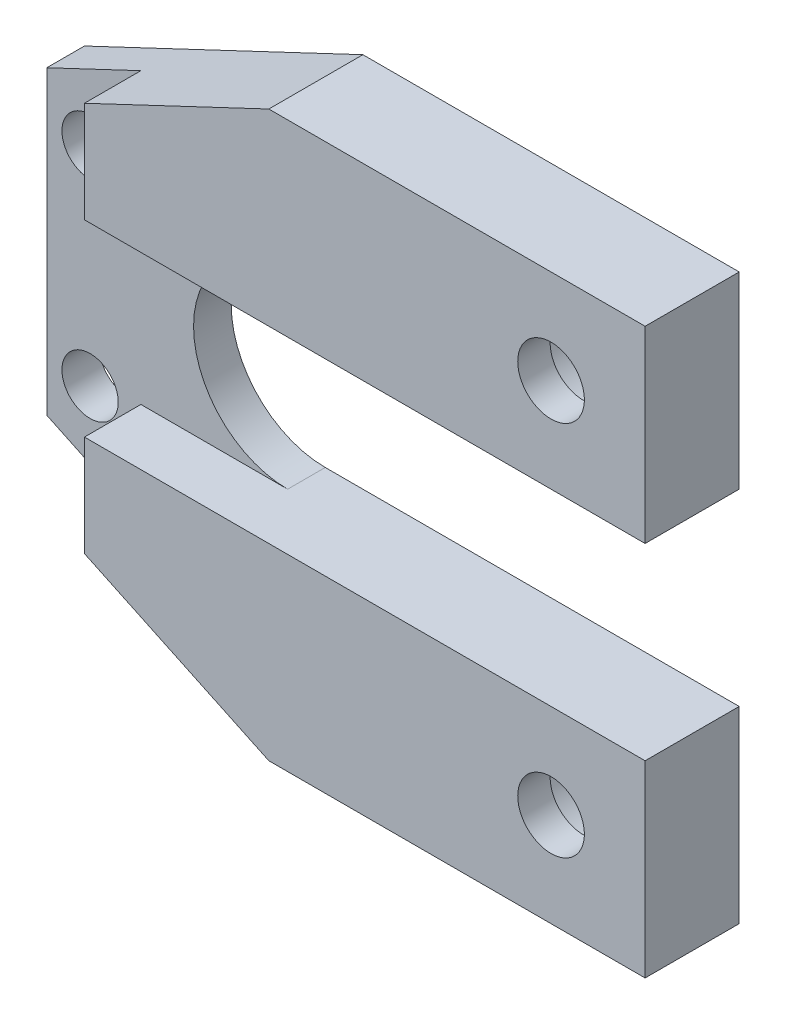
ISO-10303-21;
HEADER;
FILE_DESCRIPTION(('STEP AP214'),'2;1');
FILE_NAME('part.step','',(''),(''),'','','');
FILE_SCHEMA(('AUTOMOTIVE_DESIGN { 1 0 10303 214 1 1 1 1 }'));
ENDSEC;
DATA;
#1=APPLICATION_CONTEXT('core data for automotive mechanical design processes');
#2=APPLICATION_PROTOCOL_DEFINITION('international standard','automotive_design',2000,#1);
#3=PRODUCT_CONTEXT('',#1,'mechanical');
#4=PRODUCT('Part','Part','',(#3));
#5=PRODUCT_RELATED_PRODUCT_CATEGORY('part','',(#4));
#6=PRODUCT_DEFINITION_FORMATION('','',#4);
#7=PRODUCT_DEFINITION_CONTEXT('part definition',#1,'design');
#8=PRODUCT_DEFINITION('design','',#6,#7);
#9=PRODUCT_DEFINITION_SHAPE('','',#8);
#10=(LENGTH_UNIT() NAMED_UNIT(*) SI_UNIT(.MILLI.,.METRE.));
#11=(NAMED_UNIT(*) PLANE_ANGLE_UNIT() SI_UNIT($,.RADIAN.));
#12=(NAMED_UNIT(*) SI_UNIT($,.STERADIAN.) SOLID_ANGLE_UNIT());
#13=UNCERTAINTY_MEASURE_WITH_UNIT(LENGTH_MEASURE(1.E-05),#10,'distance_accuracy_value','');
#14=(GEOMETRIC_REPRESENTATION_CONTEXT(3) GLOBAL_UNCERTAINTY_ASSIGNED_CONTEXT((#13)) GLOBAL_UNIT_ASSIGNED_CONTEXT((#10,
#11,#12)) REPRESENTATION_CONTEXT('',''));
#15=CARTESIAN_POINT('',(0.,0.,0.));
#16=DIRECTION('',(0.,0.,1.));
#17=DIRECTION('',(1.,0.,0.));
#18=AXIS2_PLACEMENT_3D('',#15,#16,#17);
#19=CARTESIAN_POINT('',(6.35,38.1,0.));
#20=DIRECTION('',(1.,0.,0.));
#21=DIRECTION('',(0.,0.,-1.));
#22=AXIS2_PLACEMENT_3D('',#19,#20,#21);
#23=PLANE('',#22);
#24=DIRECTION('',(0.,-1.,0.));
#25=VECTOR('',#24,1.);
#26=CARTESIAN_POINT('',(6.35,38.1,0.));
#27=LINE('',#26,#25);
#28=CARTESIAN_POINT('',(6.35,32.2133783783784,0.));
#29=VERTEX_POINT('',#28);
#30=CARTESIAN_POINT('',(6.35,25.4,0.));
#31=VERTEX_POINT('',#30);
#32=EDGE_CURVE('E153',#29,#31,#27,.T.);
#33=ORIENTED_EDGE('',*,*,#32,.T.);
#34=DIRECTION('',(0.,0.,1.));
#35=VECTOR('',#34,1.);
#36=CARTESIAN_POINT('',(6.35,25.4,-16.1064842842875));
#37=LINE('',#36,#35);
#38=CARTESIAN_POINT('',(6.35,25.4,3.81));
#39=VERTEX_POINT('',#38);
#40=EDGE_CURVE('E138',#31,#39,#37,.T.);
#41=ORIENTED_EDGE('',*,*,#40,.T.);
#42=DIRECTION('',(0.,-1.,0.));
#43=VECTOR('',#42,1.);
#44=CARTESIAN_POINT('',(6.35,38.1,3.81));
#45=LINE('',#44,#43);
#46=CARTESIAN_POINT('',(6.35,32.2133783783784,3.81));
#47=VERTEX_POINT('',#46);
#48=EDGE_CURVE('E164',#47,#39,#45,.T.);
#49=ORIENTED_EDGE('',*,*,#48,.F.);
#50=DIRECTION('',(0.,0.,-1.));
#51=VECTOR('',#50,1.);
#52=CARTESIAN_POINT('',(6.35,32.2133783783784,0.));
#53=LINE('',#52,#51);
#54=EDGE_CURVE('E157',#47,#29,#53,.T.);
#55=ORIENTED_EDGE('',*,*,#54,.T.);
#56=EDGE_LOOP('',(#33,#41,#49,#55));
#57=FACE_BOUND('',#56,.T.);
#58=ADVANCED_FACE('F39',(#57),#23,.F.);
#59=CARTESIAN_POINT('',(6.35,38.1,3.81));
#60=DIRECTION('',(0.,0.,-1.));
#61=DIRECTION('',(-1.,0.,0.));
#62=AXIS2_PLACEMENT_3D('',#59,#60,#61);
#63=PLANE('',#62);
#64=CARTESIAN_POINT('',(37.846,31.75,3.81));
#65=DIRECTION('',(0.,0.,-1.));
#66=DIRECTION('',(-1.,0.,0.));
#67=AXIS2_PLACEMENT_3D('',#64,#65,#66);
#68=CIRCLE('',#67,2.2479);
#69=CARTESIAN_POINT('',(35.5981,31.75,3.81));
#70=VERTEX_POINT('',#69);
#71=EDGE_CURVE('E221',#70,#70,#68,.T.);
#72=ORIENTED_EDGE('',*,*,#71,.T.);
#73=EDGE_LOOP('',(#72));
#74=FACE_BOUND('',#73,.T.);
#75=ORIENTED_EDGE('',*,*,#48,.T.);
#76=DIRECTION('',(1.,0.,0.));
#77=VECTOR('',#76,1.);
#78=CARTESIAN_POINT('',(16.256,25.4,3.81));
#79=LINE('',#78,#77);
#80=CARTESIAN_POINT('',(44.196,25.4,3.81));
#81=VERTEX_POINT('',#80);
#82=EDGE_CURVE('E141',#39,#81,#79,.T.);
#83=ORIENTED_EDGE('',*,*,#82,.T.);
#84=DIRECTION('',(0.,-1.,0.));
#85=VECTOR('',#84,1.);
#86=CARTESIAN_POINT('',(44.196,38.1,3.81));
#87=LINE('',#86,#85);
#88=CARTESIAN_POINT('',(44.196,38.1,3.81));
#89=VERTEX_POINT('',#88);
#90=EDGE_CURVE('E169',#89,#81,#87,.T.);
#91=ORIENTED_EDGE('',*,*,#90,.F.);
#92=DIRECTION('',(1.,0.,0.));
#93=VECTOR('',#92,1.);
#94=CARTESIAN_POINT('',(6.35,38.1,3.81));
#95=LINE('',#94,#93);
#96=CARTESIAN_POINT('',(18.796,38.1,3.81));
#97=VERTEX_POINT('',#96);
#98=EDGE_CURVE('E188',#97,#89,#95,.T.);
#99=ORIENTED_EDGE('',*,*,#98,.F.);
#100=DIRECTION('',(-0.903986429079886,-0.427561148889135,0.));
#101=VECTOR('',#100,1.);
#102=CARTESIAN_POINT('',(0.,29.21,3.81));
#103=LINE('',#102,#101);
#104=EDGE_CURVE('E270',#97,#47,#103,.T.);
#105=ORIENTED_EDGE('',*,*,#104,.T.);
#106=EDGE_LOOP('',(#75,#83,#91,#99,#105));
#107=FACE_BOUND('',#106,.T.);
#108=ADVANCED_FACE('F348',(#74,#107),#63,.F.);
#109=CARTESIAN_POINT('',(44.196,38.1,0.814646677041098));
#110=DIRECTION('',(-1.,0.,0.));
#111=DIRECTION('',(0.,0.,1.));
#112=AXIS2_PLACEMENT_3D('',#109,#110,#111);
#113=PLANE('',#112);
#114=DIRECTION('',(0.,-1.,0.));
#115=VECTOR('',#114,1.);
#116=CARTESIAN_POINT('',(44.196,38.1,-2.54));
#117=LINE('',#116,#115);
#118=CARTESIAN_POINT('',(44.196,12.7,-2.54));
#119=VERTEX_POINT('',#118);
#120=CARTESIAN_POINT('',(44.196,0.,-2.54));
#121=VERTEX_POINT('',#120);
#122=EDGE_CURVE('E178',#119,#121,#117,.T.);
#123=ORIENTED_EDGE('',*,*,#122,.F.);
#124=DIRECTION('',(0.,0.,-1.));
#125=VECTOR('',#124,1.);
#126=CARTESIAN_POINT('',(44.196,12.7,3.81));
#127=LINE('',#126,#125);
#128=CARTESIAN_POINT('',(44.196,12.7,3.81));
#129=VERTEX_POINT('',#128);
#130=EDGE_CURVE('E302',#129,#119,#127,.T.);
#131=ORIENTED_EDGE('',*,*,#130,.F.);
#132=CARTESIAN_POINT('',(44.196,0.,3.81));
#133=VERTEX_POINT('',#132);
#134=EDGE_CURVE('E173',#129,#133,#87,.T.);
#135=ORIENTED_EDGE('',*,*,#134,.T.);
#136=DIRECTION('',(0.,0.,-1.));
#137=VECTOR('',#136,1.);
#138=CARTESIAN_POINT('',(44.196,0.,0.814646677041098));
#139=LINE('',#138,#137);
#140=EDGE_CURVE('E189',#133,#121,#139,.T.);
#141=ORIENTED_EDGE('',*,*,#140,.T.);
#142=EDGE_LOOP('',(#123,#131,#135,#141));
#143=FACE_BOUND('',#142,.T.);
#144=ADVANCED_FACE('F370',(#143),#113,.F.);
#145=CARTESIAN_POINT('',(0.,38.1,0.));
#146=DIRECTION('',(1.,0.,0.));
#147=DIRECTION('',(0.,0.,-1.));
#148=AXIS2_PLACEMENT_3D('',#145,#146,#147);
#149=PLANE('',#148);
#150=DIRECTION('',(0.,-1.,0.));
#151=VECTOR('',#150,1.);
#152=CARTESIAN_POINT('',(0.,38.1,0.));
#153=LINE('',#152,#151);
#154=CARTESIAN_POINT('',(0.,29.21,0.));
#155=VERTEX_POINT('',#154);
#156=CARTESIAN_POINT('',(0.,8.89,0.));
#157=VERTEX_POINT('',#156);
#158=EDGE_CURVE('E48',#155,#157,#153,.T.);
#159=ORIENTED_EDGE('',*,*,#158,.F.);
#160=DIRECTION('',(0.,0.,-1.));
#161=VECTOR('',#160,1.);
#162=CARTESIAN_POINT('',(0.,29.21,3.81));
#163=LINE('',#162,#161);
#164=CARTESIAN_POINT('',(0.,29.21,-2.54));
#165=VERTEX_POINT('',#164);
#166=EDGE_CURVE('E250',#155,#165,#163,.T.);
#167=ORIENTED_EDGE('',*,*,#166,.T.);
#168=DIRECTION('',(0.,-1.,0.));
#169=VECTOR('',#168,1.);
#170=CARTESIAN_POINT('',(0.,38.1,-2.54));
#171=LINE('',#170,#169);
#172=CARTESIAN_POINT('',(0.,8.89,-2.54));
#173=VERTEX_POINT('',#172);
#174=EDGE_CURVE('E179',#165,#173,#171,.T.);
#175=ORIENTED_EDGE('',*,*,#174,.T.);
#176=DIRECTION('',(0.,0.,-1.));
#177=VECTOR('',#176,1.);
#178=CARTESIAN_POINT('',(0.,8.89,3.81));
#179=LINE('',#178,#177);
#180=EDGE_CURVE('E251',#157,#173,#179,.T.);
#181=ORIENTED_EDGE('',*,*,#180,.F.);
#182=EDGE_LOOP('',(#159,#167,#175,#181));
#183=FACE_BOUND('',#182,.T.);
#184=ADVANCED_FACE('F41',(#183),#149,.F.);
#185=CARTESIAN_POINT('',(0.,38.1,0.));
#186=DIRECTION('',(0.,0.,-1.));
#187=DIRECTION('',(-1.,0.,0.));
#188=AXIS2_PLACEMENT_3D('',#185,#186,#187);
#189=PLANE('',#188);
#190=CARTESIAN_POINT('',(2.921,26.035,0.));
#191=DIRECTION('',(0.,0.,-1.));
#192=DIRECTION('',(-1.,0.,0.));
#193=AXIS2_PLACEMENT_3D('',#190,#191,#192);
#194=CIRCLE('',#193,1.89865);
#195=CARTESIAN_POINT('',(1.02235,26.035,0.));
#196=VERTEX_POINT('',#195);
#197=EDGE_CURVE('E286',#196,#196,#194,.T.);
#198=ORIENTED_EDGE('',*,*,#197,.T.);
#199=EDGE_LOOP('',(#198));
#200=FACE_BOUND('',#199,.T.);
#201=CARTESIAN_POINT('',(2.921,12.065,0.));
#202=DIRECTION('',(0.,0.,-1.));
#203=DIRECTION('',(-1.,0.,0.));
#204=AXIS2_PLACEMENT_3D('',#201,#202,#203);
#205=CIRCLE('',#204,1.89865);
#206=CARTESIAN_POINT('',(1.02235,12.065,0.));
#207=VERTEX_POINT('',#206);
#208=EDGE_CURVE('E263',#207,#207,#205,.T.);
#209=ORIENTED_EDGE('',*,*,#208,.T.);
#210=EDGE_LOOP('',(#209));
#211=FACE_BOUND('',#210,.T.);
#212=ORIENTED_EDGE('',*,*,#32,.F.);
#213=DIRECTION('',(-0.903986429079886,-0.427561148889135,0.));
#214=VECTOR('',#213,1.);
#215=CARTESIAN_POINT('',(3.43606924339651,30.8351678853902,0.));
#216=LINE('',#215,#214);
#217=EDGE_CURVE('E237',#29,#155,#216,.T.);
#218=ORIENTED_EDGE('',*,*,#217,.T.);
#219=ORIENTED_EDGE('',*,*,#158,.T.);
#220=DIRECTION('',(0.903986429079886,-0.427561148889135,0.));
#221=VECTOR('',#220,1.);
#222=CARTESIAN_POINT('',(-11.2899417997314,14.2298373377108,0.));
#223=LINE('',#222,#221);
#224=CARTESIAN_POINT('',(6.35,5.88662162162162,0.));
#225=VERTEX_POINT('',#224);
#226=EDGE_CURVE('E242',#157,#225,#223,.T.);
#227=ORIENTED_EDGE('',*,*,#226,.T.);
#228=CARTESIAN_POINT('',(6.35,12.7,0.));
#229=VERTEX_POINT('',#228);
#230=EDGE_CURVE('E159',#229,#225,#27,.T.);
#231=ORIENTED_EDGE('',*,*,#230,.F.);
#232=DIRECTION('',(1.,0.,0.));
#233=VECTOR('',#232,1.);
#234=CARTESIAN_POINT('',(16.256,12.7,0.));
#235=LINE('',#234,#233);
#236=CARTESIAN_POINT('',(16.256,12.7,0.));
#237=VERTEX_POINT('',#236);
#238=EDGE_CURVE('E317',#229,#237,#235,.T.);
#239=ORIENTED_EDGE('',*,*,#238,.T.);
#240=CARTESIAN_POINT('',(16.256,19.05,0.));
#241=DIRECTION('',(0.,0.,-1.));
#242=DIRECTION('',(-1.,0.,0.));
#243=AXIS2_PLACEMENT_3D('',#240,#241,#242);
#244=CIRCLE('',#243,6.35);
#245=CARTESIAN_POINT('',(16.256,25.4,0.));
#246=VERTEX_POINT('',#245);
#247=EDGE_CURVE('E11',#246,#237,#244,.F.);
#248=ORIENTED_EDGE('',*,*,#247,.F.);
#249=DIRECTION('',(-1.,0.,0.));
#250=VECTOR('',#249,1.);
#251=CARTESIAN_POINT('',(16.256,25.4,0.));
#252=LINE('',#251,#250);
#253=EDGE_CURVE('E55',#246,#31,#252,.T.);
#254=ORIENTED_EDGE('',*,*,#253,.T.);
#255=EDGE_LOOP('',(#212,#218,#219,#227,#231,#239,#248,#254));
#256=FACE_BOUND('',#255,.T.);
#257=ADVANCED_FACE('F151',(#200,#211,#256),#189,.F.);
#258=CARTESIAN_POINT('',(6.35,12.7,3.81));
#259=VERTEX_POINT('',#258);
#260=CARTESIAN_POINT('',(6.35,5.88662162162162,3.81));
#261=VERTEX_POINT('',#260);
#262=EDGE_CURVE('E168',#259,#261,#45,.T.);
#263=ORIENTED_EDGE('',*,*,#262,.F.);
#264=DIRECTION('',(0.,0.,1.));
#265=VECTOR('',#264,1.);
#266=CARTESIAN_POINT('',(6.35,12.7,-16.1064842842875));
#267=LINE('',#266,#265);
#268=EDGE_CURVE('E147',#229,#259,#267,.T.);
#269=ORIENTED_EDGE('',*,*,#268,.F.);
#270=ORIENTED_EDGE('',*,*,#230,.T.);
#271=DIRECTION('',(0.,0.,1.));
#272=VECTOR('',#271,1.);
#273=CARTESIAN_POINT('',(6.35,5.88662162162162,0.));
#274=LINE('',#273,#272);
#275=EDGE_CURVE('E246',#225,#261,#274,.T.);
#276=ORIENTED_EDGE('',*,*,#275,.T.);
#277=EDGE_LOOP('',(#263,#269,#270,#276));
#278=FACE_BOUND('',#277,.T.);
#279=ADVANCED_FACE('F366',(#278),#23,.F.);
#280=CARTESIAN_POINT('',(37.846,6.35,3.81));
#281=DIRECTION('',(0.,0.,-1.));
#282=DIRECTION('',(-1.,0.,0.));
#283=AXIS2_PLACEMENT_3D('',#280,#281,#282);
#284=CIRCLE('',#283,2.2479);
#285=CARTESIAN_POINT('',(35.5981,6.35,3.81));
#286=VERTEX_POINT('',#285);
#287=EDGE_CURVE('E197',#286,#286,#284,.T.);
#288=ORIENTED_EDGE('',*,*,#287,.T.);
#289=EDGE_LOOP('',(#288));
#290=FACE_BOUND('',#289,.T.);
#291=DIRECTION('',(-1.,0.,0.));
#292=VECTOR('',#291,1.);
#293=CARTESIAN_POINT('',(16.256,12.7,3.81));
#294=LINE('',#293,#292);
#295=EDGE_CURVE('E298',#129,#259,#294,.T.);
#296=ORIENTED_EDGE('',*,*,#295,.T.);
#297=ORIENTED_EDGE('',*,*,#262,.T.);
#298=DIRECTION('',(0.903986429079886,-0.427561148889135,0.));
#299=VECTOR('',#298,1.);
#300=CARTESIAN_POINT('',(0.,8.89,3.81));
#301=LINE('',#300,#299);
#302=CARTESIAN_POINT('',(18.796,0.,3.81));
#303=VERTEX_POINT('',#302);
#304=EDGE_CURVE('E255',#261,#303,#301,.T.);
#305=ORIENTED_EDGE('',*,*,#304,.T.);
#306=DIRECTION('',(1.,0.,0.));
#307=VECTOR('',#306,1.);
#308=CARTESIAN_POINT('',(6.35,0.,3.81));
#309=LINE('',#308,#307);
#310=EDGE_CURVE('E193',#303,#133,#309,.T.);
#311=ORIENTED_EDGE('',*,*,#310,.T.);
#312=ORIENTED_EDGE('',*,*,#134,.F.);
#313=EDGE_LOOP('',(#296,#297,#305,#311,#312));
#314=FACE_BOUND('',#313,.T.);
#315=ADVANCED_FACE('F371',(#290,#314),#63,.F.);
#316=ORIENTED_EDGE('',*,*,#90,.T.);
#317=DIRECTION('',(0.,0.,-1.));
#318=VECTOR('',#317,1.);
#319=CARTESIAN_POINT('',(44.196,25.4,3.81));
#320=LINE('',#319,#318);
#321=CARTESIAN_POINT('',(44.196,25.4,-2.54));
#322=VERTEX_POINT('',#321);
#323=EDGE_CURVE('E297',#81,#322,#320,.T.);
#324=ORIENTED_EDGE('',*,*,#323,.T.);
#325=CARTESIAN_POINT('',(44.196,38.1,-2.54));
#326=VERTEX_POINT('',#325);
#327=EDGE_CURVE('E174',#326,#322,#117,.T.);
#328=ORIENTED_EDGE('',*,*,#327,.F.);
#329=DIRECTION('',(0.,0.,-1.));
#330=VECTOR('',#329,1.);
#331=CARTESIAN_POINT('',(44.196,38.1,0.814646677041098));
#332=LINE('',#331,#330);
#333=EDGE_CURVE('E201',#89,#326,#332,.T.);
#334=ORIENTED_EDGE('',*,*,#333,.F.);
#335=EDGE_LOOP('',(#316,#324,#328,#334));
#336=FACE_BOUND('',#335,.T.);
#337=ADVANCED_FACE('F343',(#336),#113,.F.);
#338=CARTESIAN_POINT('',(0.,38.1,-2.54));
#339=DIRECTION('',(0.,0.,1.));
#340=DIRECTION('',(1.,0.,0.));
#341=AXIS2_PLACEMENT_3D('',#338,#339,#340);
#342=PLANE('',#341);
#343=CARTESIAN_POINT('',(2.921,26.035,-2.54));
#344=DIRECTION('',(0.,0.,-1.));
#345=DIRECTION('',(-1.,0.,0.));
#346=AXIS2_PLACEMENT_3D('',#343,#344,#345);
#347=CIRCLE('',#346,1.89865);
#348=CARTESIAN_POINT('',(1.02235,26.035,-2.54));
#349=VERTEX_POINT('',#348);
#350=EDGE_CURVE('E290',#349,#349,#347,.T.);
#351=ORIENTED_EDGE('',*,*,#350,.F.);
#352=EDGE_LOOP('',(#351));
#353=FACE_BOUND('',#352,.T.);
#354=CARTESIAN_POINT('',(2.921,12.065,-2.54));
#355=DIRECTION('',(0.,0.,-1.));
#356=DIRECTION('',(-1.,0.,0.));
#357=AXIS2_PLACEMENT_3D('',#354,#355,#356);
#358=CIRCLE('',#357,1.89865);
#359=CARTESIAN_POINT('',(1.02235,12.065,-2.54));
#360=VERTEX_POINT('',#359);
#361=EDGE_CURVE('E282',#360,#360,#358,.T.);
#362=ORIENTED_EDGE('',*,*,#361,.F.);
#363=EDGE_LOOP('',(#362));
#364=FACE_BOUND('',#363,.T.);
#365=CARTESIAN_POINT('',(37.846,31.75,-2.54));
#366=DIRECTION('',(0.,0.,-1.));
#367=DIRECTION('',(-1.,0.,0.));
#368=AXIS2_PLACEMENT_3D('',#365,#366,#367);
#369=CIRCLE('',#368,3.96875);
#370=CARTESIAN_POINT('',(33.87725,31.75,-2.54));
#371=VERTEX_POINT('',#370);
#372=EDGE_CURVE('E233',#371,#371,#369,.T.);
#373=ORIENTED_EDGE('',*,*,#372,.F.);
#374=EDGE_LOOP('',(#373));
#375=FACE_BOUND('',#374,.T.);
#376=CARTESIAN_POINT('',(37.846,6.35,-2.54));
#377=DIRECTION('',(0.,0.,-1.));
#378=DIRECTION('',(-1.,0.,0.));
#379=AXIS2_PLACEMENT_3D('',#376,#377,#378);
#380=CIRCLE('',#379,3.96875);
#381=CARTESIAN_POINT('',(33.87725,6.35,-2.54));
#382=VERTEX_POINT('',#381);
#383=EDGE_CURVE('E217',#382,#382,#380,.T.);
#384=ORIENTED_EDGE('',*,*,#383,.F.);
#385=EDGE_LOOP('',(#384));
#386=FACE_BOUND('',#385,.T.);
#387=CARTESIAN_POINT('',(16.256,19.05,-2.54));
#388=DIRECTION('',(0.,0.,-1.));
#389=DIRECTION('',(-1.,0.,0.));
#390=AXIS2_PLACEMENT_3D('',#387,#388,#389);
#391=CIRCLE('',#390,6.35);
#392=CARTESIAN_POINT('',(16.256,12.7,-2.54));
#393=VERTEX_POINT('',#392);
#394=CARTESIAN_POINT('',(16.256,25.4,-2.54));
#395=VERTEX_POINT('',#394);
#396=EDGE_CURVE('E314',#393,#395,#391,.T.);
#397=ORIENTED_EDGE('',*,*,#396,.F.);
#398=DIRECTION('',(-1.,0.,0.));
#399=VECTOR('',#398,1.);
#400=CARTESIAN_POINT('',(16.256,12.7,-2.54));
#401=LINE('',#400,#399);
#402=EDGE_CURVE('E307',#119,#393,#401,.T.);
#403=ORIENTED_EDGE('',*,*,#402,.F.);
#404=ORIENTED_EDGE('',*,*,#122,.T.);
#405=DIRECTION('',(-1.,0.,0.));
#406=VECTOR('',#405,1.);
#407=CARTESIAN_POINT('',(0.,0.,-2.54));
#408=LINE('',#407,#406);
#409=CARTESIAN_POINT('',(18.796,0.,-2.54));
#410=VERTEX_POINT('',#409);
#411=EDGE_CURVE('E184',#121,#410,#408,.T.);
#412=ORIENTED_EDGE('',*,*,#411,.T.);
#413=DIRECTION('',(0.903986429079886,-0.427561148889135,0.));
#414=VECTOR('',#413,1.);
#415=CARTESIAN_POINT('',(0.,8.89,-2.54));
#416=LINE('',#415,#414);
#417=EDGE_CURVE('E260',#173,#410,#416,.T.);
#418=ORIENTED_EDGE('',*,*,#417,.F.);
#419=ORIENTED_EDGE('',*,*,#174,.F.);
#420=DIRECTION('',(-0.903986429079886,-0.427561148889135,0.));
#421=VECTOR('',#420,1.);
#422=CARTESIAN_POINT('',(0.,29.21,-2.54));
#423=LINE('',#422,#421);
#424=CARTESIAN_POINT('',(18.796,38.1,-2.54));
#425=VERTEX_POINT('',#424);
#426=EDGE_CURVE('E259',#425,#165,#423,.T.);
#427=ORIENTED_EDGE('',*,*,#426,.F.);
#428=DIRECTION('',(-1.,0.,0.));
#429=VECTOR('',#428,1.);
#430=CARTESIAN_POINT('',(0.,38.1,-2.54));
#431=LINE('',#430,#429);
#432=EDGE_CURVE('E183',#326,#425,#431,.T.);
#433=ORIENTED_EDGE('',*,*,#432,.F.);
#434=ORIENTED_EDGE('',*,*,#327,.T.);
#435=DIRECTION('',(1.,0.,0.));
#436=VECTOR('',#435,1.);
#437=CARTESIAN_POINT('',(16.256,25.4,-2.54));
#438=LINE('',#437,#436);
#439=EDGE_CURVE('E311',#395,#322,#438,.T.);
#440=ORIENTED_EDGE('',*,*,#439,.F.);
#441=EDGE_LOOP('',(#397,#403,#404,#412,#418,#419,#427,#433,#434,#440));
#442=FACE_BOUND('',#441,.T.);
#443=ADVANCED_FACE('F339',(#353,#364,#375,#386,#442),#342,.F.);
#444=CARTESIAN_POINT('',(0.,38.1,0.));
#445=DIRECTION('',(0.,-1.,0.));
#446=DIRECTION('',(0.,0.,-1.));
#447=AXIS2_PLACEMENT_3D('',#444,#445,#446);
#448=PLANE('',#447);
#449=ORIENTED_EDGE('',*,*,#432,.T.);
#450=DIRECTION('',(0.,0.,-1.));
#451=VECTOR('',#450,1.);
#452=CARTESIAN_POINT('',(18.796,38.1,3.81));
#453=LINE('',#452,#451);
#454=EDGE_CURVE('E267',#97,#425,#453,.T.);
#455=ORIENTED_EDGE('',*,*,#454,.F.);
#456=ORIENTED_EDGE('',*,*,#98,.T.);
#457=ORIENTED_EDGE('',*,*,#333,.T.);
#458=EDGE_LOOP('',(#449,#455,#456,#457));
#459=FACE_BOUND('',#458,.T.);
#460=ADVANCED_FACE('F354',(#459),#448,.F.);
#461=CARTESIAN_POINT('',(0.,0.,0.));
#462=DIRECTION('',(0.,-1.,0.));
#463=DIRECTION('',(0.,0.,-1.));
#464=AXIS2_PLACEMENT_3D('',#461,#462,#463);
#465=PLANE('',#464);
#466=DIRECTION('',(0.,0.,-1.));
#467=VECTOR('',#466,1.);
#468=CARTESIAN_POINT('',(18.796,0.,3.81));
#469=LINE('',#468,#467);
#470=EDGE_CURVE('E254',#303,#410,#469,.T.);
#471=ORIENTED_EDGE('',*,*,#470,.T.);
#472=ORIENTED_EDGE('',*,*,#411,.F.);
#473=ORIENTED_EDGE('',*,*,#140,.F.);
#474=ORIENTED_EDGE('',*,*,#310,.F.);
#475=EDGE_LOOP('',(#471,#472,#473,#474));
#476=FACE_BOUND('',#475,.T.);
#477=ADVANCED_FACE('F379',(#476),#465,.T.);
#478=CARTESIAN_POINT('',(37.846,6.35,-2.54));
#479=DIRECTION('',(0.,0.,-1.));
#480=DIRECTION('',(-1.,0.,0.));
#481=AXIS2_PLACEMENT_3D('',#478,#479,#480);
#482=CYLINDRICAL_SURFACE('',#481,2.2479);
#483=ORIENTED_EDGE('',*,*,#287,.F.);
#484=EDGE_LOOP('',(#483));
#485=FACE_BOUND('',#484,.T.);
#486=CARTESIAN_POINT('',(37.846,6.35,1.6256));
#487=DIRECTION('',(0.,0.,-1.));
#488=DIRECTION('',(-1.,0.,0.));
#489=AXIS2_PLACEMENT_3D('',#486,#487,#488);
#490=CIRCLE('',#489,2.2479);
#491=CARTESIAN_POINT('',(35.5981,6.35,1.6256));
#492=VERTEX_POINT('',#491);
#493=EDGE_CURVE('E209',#492,#492,#490,.T.);
#494=ORIENTED_EDGE('',*,*,#493,.T.);
#495=EDGE_LOOP('',(#494));
#496=FACE_BOUND('',#495,.T.);
#497=ADVANCED_FACE('F381',(#485,#496),#482,.F.);
#498=CARTESIAN_POINT('',(40.0939,6.35,1.6256));
#499=DIRECTION('',(0.,0.,1.));
#500=DIRECTION('',(1.,0.,0.));
#501=AXIS2_PLACEMENT_3D('',#498,#499,#500);
#502=PLANE('',#501);
#503=ORIENTED_EDGE('',*,*,#493,.F.);
#504=EDGE_LOOP('',(#503));
#505=FACE_BOUND('',#504,.T.);
#506=CARTESIAN_POINT('',(37.846,6.35,1.6256));
#507=DIRECTION('',(0.,0.,-1.));
#508=DIRECTION('',(-1.,0.,0.));
#509=AXIS2_PLACEMENT_3D('',#506,#507,#508);
#510=CIRCLE('',#509,3.96875);
#511=CARTESIAN_POINT('',(33.87725,6.35,1.6256));
#512=VERTEX_POINT('',#511);
#513=EDGE_CURVE('E213',#512,#512,#510,.T.);
#514=ORIENTED_EDGE('',*,*,#513,.T.);
#515=EDGE_LOOP('',(#514));
#516=FACE_BOUND('',#515,.T.);
#517=ADVANCED_FACE('F387',(#505,#516),#502,.F.);
#518=CARTESIAN_POINT('',(37.846,6.35,-2.54));
#519=DIRECTION('',(0.,0.,-1.));
#520=DIRECTION('',(-1.,0.,0.));
#521=AXIS2_PLACEMENT_3D('',#518,#519,#520);
#522=CYLINDRICAL_SURFACE('',#521,3.96875);
#523=ORIENTED_EDGE('',*,*,#513,.F.);
#524=EDGE_LOOP('',(#523));
#525=FACE_BOUND('',#524,.T.);
#526=ORIENTED_EDGE('',*,*,#383,.T.);
#527=EDGE_LOOP('',(#526));
#528=FACE_BOUND('',#527,.T.);
#529=ADVANCED_FACE('F440',(#525,#528),#522,.F.);
#530=CARTESIAN_POINT('',(37.846,31.75,-2.54));
#531=DIRECTION('',(0.,0.,-1.));
#532=DIRECTION('',(-1.,0.,0.));
#533=AXIS2_PLACEMENT_3D('',#530,#531,#532);
#534=CYLINDRICAL_SURFACE('',#533,2.2479);
#535=ORIENTED_EDGE('',*,*,#71,.F.);
#536=EDGE_LOOP('',(#535));
#537=FACE_BOUND('',#536,.T.);
#538=CARTESIAN_POINT('',(37.846,31.75,1.6256));
#539=DIRECTION('',(0.,0.,-1.));
#540=DIRECTION('',(-1.,0.,0.));
#541=AXIS2_PLACEMENT_3D('',#538,#539,#540);
#542=CIRCLE('',#541,2.2479);
#543=CARTESIAN_POINT('',(35.5981,31.75,1.6256));
#544=VERTEX_POINT('',#543);
#545=EDGE_CURVE('E225',#544,#544,#542,.T.);
#546=ORIENTED_EDGE('',*,*,#545,.T.);
#547=EDGE_LOOP('',(#546));
#548=FACE_BOUND('',#547,.T.);
#549=ADVANCED_FACE('F436',(#537,#548),#534,.F.);
#550=CARTESIAN_POINT('',(40.0939,31.75,1.6256));
#551=DIRECTION('',(0.,0.,1.));
#552=DIRECTION('',(1.,0.,0.));
#553=AXIS2_PLACEMENT_3D('',#550,#551,#552);
#554=PLANE('',#553);
#555=ORIENTED_EDGE('',*,*,#545,.F.);
#556=EDGE_LOOP('',(#555));
#557=FACE_BOUND('',#556,.T.);
#558=CARTESIAN_POINT('',(37.846,31.75,1.6256));
#559=DIRECTION('',(0.,0.,-1.));
#560=DIRECTION('',(-1.,0.,0.));
#561=AXIS2_PLACEMENT_3D('',#558,#559,#560);
#562=CIRCLE('',#561,3.96875);
#563=CARTESIAN_POINT('',(33.87725,31.75,1.6256));
#564=VERTEX_POINT('',#563);
#565=EDGE_CURVE('E229',#564,#564,#562,.T.);
#566=ORIENTED_EDGE('',*,*,#565,.T.);
#567=EDGE_LOOP('',(#566));
#568=FACE_BOUND('',#567,.T.);
#569=ADVANCED_FACE('F432',(#557,#568),#554,.F.);
#570=CARTESIAN_POINT('',(37.846,31.75,-2.54));
#571=DIRECTION('',(0.,0.,-1.));
#572=DIRECTION('',(-1.,0.,0.));
#573=AXIS2_PLACEMENT_3D('',#570,#571,#572);
#574=CYLINDRICAL_SURFACE('',#573,3.96875);
#575=ORIENTED_EDGE('',*,*,#565,.F.);
#576=EDGE_LOOP('',(#575));
#577=FACE_BOUND('',#576,.T.);
#578=ORIENTED_EDGE('',*,*,#372,.T.);
#579=EDGE_LOOP('',(#578));
#580=FACE_BOUND('',#579,.T.);
#581=ADVANCED_FACE('F429',(#577,#580),#574,.F.);
#582=CARTESIAN_POINT('',(0.,8.89,3.81));
#583=DIRECTION('',(0.427561148889135,0.903986429079885,0.));
#584=DIRECTION('',(-0.903986429079885,0.427561148889135,0.));
#585=AXIS2_PLACEMENT_3D('',#582,#583,#584);
#586=PLANE('',#585);
#587=ORIENTED_EDGE('',*,*,#180,.T.);
#588=ORIENTED_EDGE('',*,*,#417,.T.);
#589=ORIENTED_EDGE('',*,*,#470,.F.);
#590=ORIENTED_EDGE('',*,*,#304,.F.);
#591=ORIENTED_EDGE('',*,*,#275,.F.);
#592=ORIENTED_EDGE('',*,*,#226,.F.);
#593=EDGE_LOOP('',(#587,#588,#589,#590,#591,#592));
#594=FACE_BOUND('',#593,.T.);
#595=ADVANCED_FACE('F362',(#594),#586,.F.);
#596=CARTESIAN_POINT('',(0.,29.21,3.81));
#597=DIRECTION('',(0.427561148889135,-0.903986429079885,0.));
#598=DIRECTION('',(0.903986429079886,0.427561148889135,0.));
#599=AXIS2_PLACEMENT_3D('',#596,#597,#598);
#600=PLANE('',#599);
#601=ORIENTED_EDGE('',*,*,#54,.F.);
#602=ORIENTED_EDGE('',*,*,#104,.F.);
#603=ORIENTED_EDGE('',*,*,#454,.T.);
#604=ORIENTED_EDGE('',*,*,#426,.T.);
#605=ORIENTED_EDGE('',*,*,#166,.F.);
#606=ORIENTED_EDGE('',*,*,#217,.F.);
#607=EDGE_LOOP('',(#601,#602,#603,#604,#605,#606));
#608=FACE_BOUND('',#607,.T.);
#609=ADVANCED_FACE('F351',(#608),#600,.F.);
#610=CARTESIAN_POINT('',(2.921,12.065,-2.54));
#611=DIRECTION('',(0.,0.,-1.));
#612=DIRECTION('',(-1.,0.,0.));
#613=AXIS2_PLACEMENT_3D('',#610,#611,#612);
#614=CYLINDRICAL_SURFACE('',#613,1.89865);
#615=ORIENTED_EDGE('',*,*,#361,.T.);
#616=EDGE_LOOP('',(#615));
#617=FACE_BOUND('',#616,.T.);
#618=ORIENTED_EDGE('',*,*,#208,.F.);
#619=EDGE_LOOP('',(#618));
#620=FACE_BOUND('',#619,.T.);
#621=ADVANCED_FACE('F413',(#617,#620),#614,.F.);
#622=CARTESIAN_POINT('',(2.921,26.035,-2.54));
#623=DIRECTION('',(0.,0.,-1.));
#624=DIRECTION('',(-1.,0.,0.));
#625=AXIS2_PLACEMENT_3D('',#622,#623,#624);
#626=CYLINDRICAL_SURFACE('',#625,1.89865);
#627=ORIENTED_EDGE('',*,*,#350,.T.);
#628=EDGE_LOOP('',(#627));
#629=FACE_BOUND('',#628,.T.);
#630=ORIENTED_EDGE('',*,*,#197,.F.);
#631=EDGE_LOOP('',(#630));
#632=FACE_BOUND('',#631,.T.);
#633=ADVANCED_FACE('F415',(#629,#632),#626,.F.);
#634=CARTESIAN_POINT('',(16.256,19.05,3.81));
#635=DIRECTION('',(0.,0.,-1.));
#636=DIRECTION('',(-1.,0.,0.));
#637=AXIS2_PLACEMENT_3D('',#634,#635,#636);
#638=CYLINDRICAL_SURFACE('',#637,6.35);
#639=DIRECTION('',(0.,0.,-1.));
#640=VECTOR('',#639,1.);
#641=CARTESIAN_POINT('',(16.256,25.4,3.81));
#642=LINE('',#641,#640);
#643=EDGE_CURVE('E60',#246,#395,#642,.T.);
#644=ORIENTED_EDGE('',*,*,#643,.F.);
#645=ORIENTED_EDGE('',*,*,#247,.T.);
#646=DIRECTION('',(0.,0.,-1.));
#647=VECTOR('',#646,1.);
#648=CARTESIAN_POINT('',(16.256,12.7,3.81));
#649=LINE('',#648,#647);
#650=EDGE_CURVE('E294',#237,#393,#649,.T.);
#651=ORIENTED_EDGE('',*,*,#650,.T.);
#652=ORIENTED_EDGE('',*,*,#396,.T.);
#653=EDGE_LOOP('',(#644,#645,#651,#652));
#654=FACE_BOUND('',#653,.T.);
#655=ADVANCED_FACE('F331',(#654),#638,.F.);
#656=CARTESIAN_POINT('',(16.256,12.7,3.81));
#657=DIRECTION('',(0.,-1.,0.));
#658=DIRECTION('',(1.,0.,0.));
#659=AXIS2_PLACEMENT_3D('',#656,#657,#658);
#660=PLANE('',#659);
#661=ORIENTED_EDGE('',*,*,#402,.T.);
#662=ORIENTED_EDGE('',*,*,#650,.F.);
#663=ORIENTED_EDGE('',*,*,#238,.F.);
#664=ORIENTED_EDGE('',*,*,#268,.T.);
#665=ORIENTED_EDGE('',*,*,#295,.F.);
#666=ORIENTED_EDGE('',*,*,#130,.T.);
#667=EDGE_LOOP('',(#661,#662,#663,#664,#665,#666));
#668=FACE_BOUND('',#667,.T.);
#669=ADVANCED_FACE('F332',(#668),#660,.F.);
#670=CARTESIAN_POINT('',(16.256,25.4,3.81));
#671=DIRECTION('',(0.,1.,0.));
#672=DIRECTION('',(-1.,0.,0.));
#673=AXIS2_PLACEMENT_3D('',#670,#671,#672);
#674=PLANE('',#673);
#675=ORIENTED_EDGE('',*,*,#439,.T.);
#676=ORIENTED_EDGE('',*,*,#323,.F.);
#677=ORIENTED_EDGE('',*,*,#82,.F.);
#678=ORIENTED_EDGE('',*,*,#40,.F.);
#679=ORIENTED_EDGE('',*,*,#253,.F.);
#680=ORIENTED_EDGE('',*,*,#643,.T.);
#681=EDGE_LOOP('',(#675,#676,#677,#678,#679,#680));
#682=FACE_BOUND('',#681,.T.);
#683=ADVANCED_FACE('F139',(#682),#674,.F.);
#684=CLOSED_SHELL('',(#58,#108,#144,#184,#257,#279,#315,#337,#443,#460,#477,#497,#517,#529,#549,
#569,#581,#595,#609,#621,#633,#655,#669,#683));
#685=MANIFOLD_SOLID_BREP('B2',#684);
#686=ADVANCED_BREP_SHAPE_REPRESENTATION('',(#18,#685),#14);
#687=SHAPE_DEFINITION_REPRESENTATION(#9,#686);
ENDSEC;
END-ISO-10303-21;
